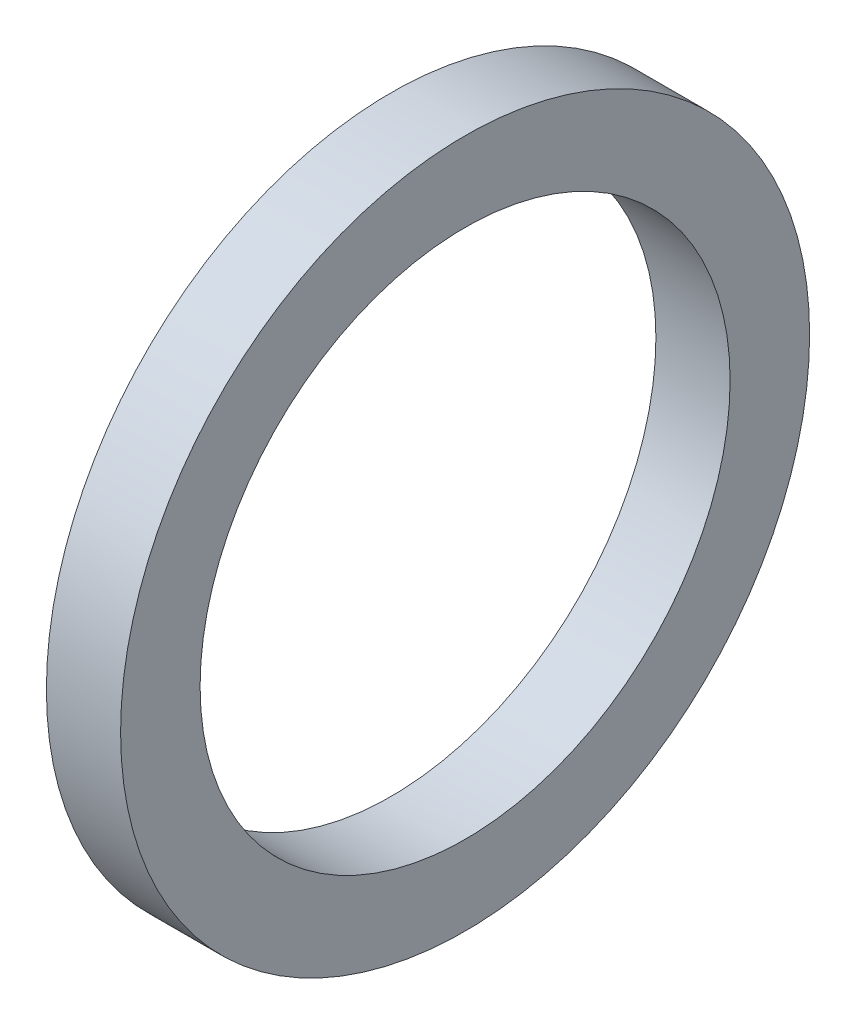
ISO-10303-21;
HEADER;
FILE_DESCRIPTION(('STEP AP214'),'2;1');
FILE_NAME('part.step','',(''),(''),'','','');
FILE_SCHEMA(('AUTOMOTIVE_DESIGN { 1 0 10303 214 1 1 1 1 }'));
ENDSEC;
DATA;
#1=APPLICATION_CONTEXT('core data for automotive mechanical design processes');
#2=APPLICATION_PROTOCOL_DEFINITION('international standard','automotive_design',2000,#1);
#3=PRODUCT_CONTEXT('',#1,'mechanical');
#4=PRODUCT('Part','Part','',(#3));
#5=PRODUCT_RELATED_PRODUCT_CATEGORY('part','',(#4));
#6=PRODUCT_DEFINITION_FORMATION('','',#4);
#7=PRODUCT_DEFINITION_CONTEXT('part definition',#1,'design');
#8=PRODUCT_DEFINITION('design','',#6,#7);
#9=PRODUCT_DEFINITION_SHAPE('','',#8);
#10=(LENGTH_UNIT() NAMED_UNIT(*) SI_UNIT(.MILLI.,.METRE.));
#11=(NAMED_UNIT(*) PLANE_ANGLE_UNIT() SI_UNIT($,.RADIAN.));
#12=(NAMED_UNIT(*) SI_UNIT($,.STERADIAN.) SOLID_ANGLE_UNIT());
#13=UNCERTAINTY_MEASURE_WITH_UNIT(LENGTH_MEASURE(1.E-05),#10,'distance_accuracy_value','');
#14=(GEOMETRIC_REPRESENTATION_CONTEXT(3) GLOBAL_UNCERTAINTY_ASSIGNED_CONTEXT((#13)) GLOBAL_UNIT_ASSIGNED_CONTEXT((#10,
#11,#12)) REPRESENTATION_CONTEXT('',''));
#15=CARTESIAN_POINT('',(0.,0.,0.));
#16=DIRECTION('',(0.,0.,1.));
#17=DIRECTION('',(1.,0.,0.));
#18=AXIS2_PLACEMENT_3D('',#15,#16,#17);
#19=CARTESIAN_POINT('',(7.,0.,0.));
#20=DIRECTION('',(1.,0.,0.));
#21=DIRECTION('',(0.,0.,-1.));
#22=AXIS2_PLACEMENT_3D('',#19,#20,#21);
#23=PLANE('',#22);
#24=CARTESIAN_POINT('',(7.,0.,0.));
#25=DIRECTION('',(1.,0.,0.));
#26=DIRECTION('',(0.,0.,-1.));
#27=AXIS2_PLACEMENT_3D('',#24,#25,#26);
#28=CIRCLE('',#27,32.5);
#29=CARTESIAN_POINT('',(7.,0.,-32.5));
#30=VERTEX_POINT('',#29);
#31=EDGE_CURVE('E10',#30,#30,#28,.T.);
#32=ORIENTED_EDGE('',*,*,#31,.T.);
#33=EDGE_LOOP('',(#32));
#34=FACE_BOUND('',#33,.T.);
#35=CARTESIAN_POINT('',(7.,0.,0.));
#36=DIRECTION('',(1.,0.,0.));
#37=DIRECTION('',(0.,0.,-1.));
#38=AXIS2_PLACEMENT_3D('',#35,#36,#37);
#39=CIRCLE('',#38,25.);
#40=CARTESIAN_POINT('',(7.,0.,-25.));
#41=VERTEX_POINT('',#40);
#42=EDGE_CURVE('E43',#41,#41,#39,.T.);
#43=ORIENTED_EDGE('',*,*,#42,.F.);
#44=EDGE_LOOP('',(#43));
#45=FACE_BOUND('',#44,.T.);
#46=ADVANCED_FACE('F32',(#34,#45),#23,.T.);
#47=CARTESIAN_POINT('',(0.,0.,0.));
#48=DIRECTION('',(1.,0.,0.));
#49=DIRECTION('',(0.,0.,-1.));
#50=AXIS2_PLACEMENT_3D('',#47,#48,#49);
#51=PLANE('',#50);
#52=CARTESIAN_POINT('',(0.,0.,0.));
#53=DIRECTION('',(1.,0.,0.));
#54=DIRECTION('',(0.,0.,-1.));
#55=AXIS2_PLACEMENT_3D('',#52,#53,#54);
#56=CIRCLE('',#55,32.5);
#57=CARTESIAN_POINT('',(0.,0.,-32.5));
#58=VERTEX_POINT('',#57);
#59=EDGE_CURVE('E36',#58,#58,#56,.T.);
#60=ORIENTED_EDGE('',*,*,#59,.F.);
#61=EDGE_LOOP('',(#60));
#62=FACE_BOUND('',#61,.T.);
#63=CARTESIAN_POINT('',(0.,0.,0.));
#64=DIRECTION('',(1.,0.,0.));
#65=DIRECTION('',(0.,0.,-1.));
#66=AXIS2_PLACEMENT_3D('',#63,#64,#65);
#67=CIRCLE('',#66,25.);
#68=CARTESIAN_POINT('',(0.,0.,-25.));
#69=VERTEX_POINT('',#68);
#70=EDGE_CURVE('E45',#69,#69,#67,.T.);
#71=ORIENTED_EDGE('',*,*,#70,.T.);
#72=EDGE_LOOP('',(#71));
#73=FACE_BOUND('',#72,.T.);
#74=ADVANCED_FACE('F55',(#62,#73),#51,.F.);
#75=CARTESIAN_POINT('',(7.,0.,0.));
#76=DIRECTION('',(-1.,0.,0.));
#77=DIRECTION('',(0.,0.,1.));
#78=AXIS2_PLACEMENT_3D('',#75,#76,#77);
#79=CYLINDRICAL_SURFACE('',#78,32.5);
#80=ORIENTED_EDGE('',*,*,#31,.F.);
#81=EDGE_LOOP('',(#80));
#82=FACE_BOUND('',#81,.T.);
#83=ORIENTED_EDGE('',*,*,#59,.T.);
#84=EDGE_LOOP('',(#83));
#85=FACE_BOUND('',#84,.T.);
#86=ADVANCED_FACE('F34',(#82,#85),#79,.T.);
#87=CARTESIAN_POINT('',(7.,0.,0.));
#88=DIRECTION('',(-1.,0.,0.));
#89=DIRECTION('',(0.,0.,1.));
#90=AXIS2_PLACEMENT_3D('',#87,#88,#89);
#91=CYLINDRICAL_SURFACE('',#90,25.);
#92=ORIENTED_EDGE('',*,*,#42,.T.);
#93=EDGE_LOOP('',(#92));
#94=FACE_BOUND('',#93,.T.);
#95=ORIENTED_EDGE('',*,*,#70,.F.);
#96=EDGE_LOOP('',(#95));
#97=FACE_BOUND('',#96,.T.);
#98=ADVANCED_FACE('F51',(#94,#97),#91,.F.);
#99=CLOSED_SHELL('',(#46,#74,#86,#98));
#100=MANIFOLD_SOLID_BREP('B2',#99);
#101=ADVANCED_BREP_SHAPE_REPRESENTATION('',(#18,#100),#14);
#102=SHAPE_DEFINITION_REPRESENTATION(#9,#101);
ENDSEC;
END-ISO-10303-21;
